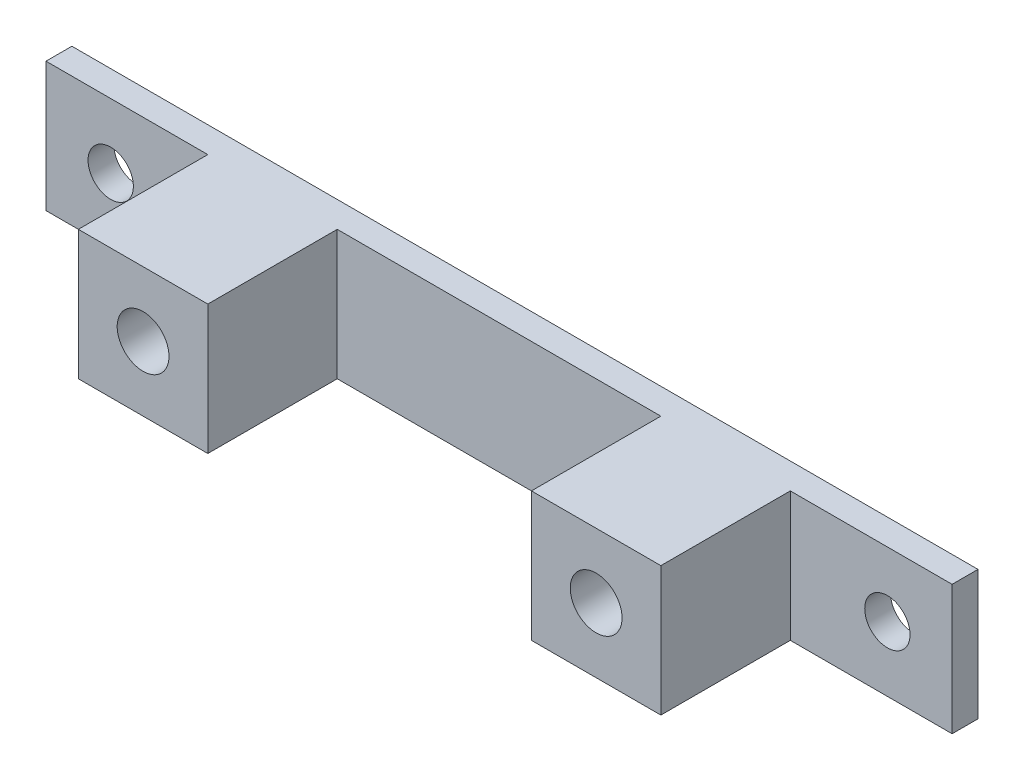
ISO-10303-21;
HEADER;
FILE_DESCRIPTION(('STEP AP214'),'2;1');
FILE_NAME('part.step','',(''),(''),'','','');
FILE_SCHEMA(('AUTOMOTIVE_DESIGN { 1 0 10303 214 1 1 1 1 }'));
ENDSEC;
DATA;
#1=APPLICATION_CONTEXT('core data for automotive mechanical design processes');
#2=APPLICATION_PROTOCOL_DEFINITION('international standard','automotive_design',2000,#1);
#3=PRODUCT_CONTEXT('',#1,'mechanical');
#4=PRODUCT('Part','Part','',(#3));
#5=PRODUCT_RELATED_PRODUCT_CATEGORY('part','',(#4));
#6=PRODUCT_DEFINITION_FORMATION('','',#4);
#7=PRODUCT_DEFINITION_CONTEXT('part definition',#1,'design');
#8=PRODUCT_DEFINITION('design','',#6,#7);
#9=PRODUCT_DEFINITION_SHAPE('','',#8);
#10=(LENGTH_UNIT() NAMED_UNIT(*) SI_UNIT(.MILLI.,.METRE.));
#11=(NAMED_UNIT(*) PLANE_ANGLE_UNIT() SI_UNIT($,.RADIAN.));
#12=(NAMED_UNIT(*) SI_UNIT($,.STERADIAN.) SOLID_ANGLE_UNIT());
#13=UNCERTAINTY_MEASURE_WITH_UNIT(LENGTH_MEASURE(1.E-05),#10,'distance_accuracy_value','');
#14=(GEOMETRIC_REPRESENTATION_CONTEXT(3) GLOBAL_UNCERTAINTY_ASSIGNED_CONTEXT((#13)) GLOBAL_UNIT_ASSIGNED_CONTEXT((#10,
#11,#12)) REPRESENTATION_CONTEXT('',''));
#15=CARTESIAN_POINT('',(0.,0.,0.));
#16=DIRECTION('',(0.,0.,1.));
#17=DIRECTION('',(1.,0.,0.));
#18=AXIS2_PLACEMENT_3D('',#15,#16,#17);
#19=CARTESIAN_POINT('',(0.,0.,2.));
#20=DIRECTION('',(0.,0.,-1.));
#21=DIRECTION('',(-1.,0.,0.));
#22=AXIS2_PLACEMENT_3D('',#19,#20,#21);
#23=PLANE('',#22);
#24=CARTESIAN_POINT('',(65.,5.,2.));
#25=DIRECTION('',(0.,0.,-1.));
#26=DIRECTION('',(-1.,0.,0.));
#27=AXIS2_PLACEMENT_3D('',#24,#25,#26);
#28=CIRCLE('',#27,1.75);
#29=CARTESIAN_POINT('',(63.25,5.,2.));
#30=VERTEX_POINT('',#29);
#31=EDGE_CURVE('E230',#30,#30,#28,.T.);
#32=ORIENTED_EDGE('',*,*,#31,.T.);
#33=EDGE_LOOP('',(#32));
#34=FACE_BOUND('',#33,.T.);
#35=DIRECTION('',(0.,1.,0.));
#36=VECTOR('',#35,1.);
#37=CARTESIAN_POINT('',(57.5,10.,2.));
#38=LINE('',#37,#36);
#39=CARTESIAN_POINT('',(57.5,0.,2.));
#40=VERTEX_POINT('',#39);
#41=CARTESIAN_POINT('',(57.5,10.,2.));
#42=VERTEX_POINT('',#41);
#43=EDGE_CURVE('E54',#40,#42,#38,.T.);
#44=ORIENTED_EDGE('',*,*,#43,.F.);
#45=DIRECTION('',(1.,0.,0.));
#46=VECTOR('',#45,1.);
#47=CARTESIAN_POINT('',(0.,0.,2.));
#48=LINE('',#47,#46);
#49=CARTESIAN_POINT('',(70.,0.,2.));
#50=VERTEX_POINT('',#49);
#51=EDGE_CURVE('E188',#40,#50,#48,.T.);
#52=ORIENTED_EDGE('',*,*,#51,.T.);
#53=DIRECTION('',(0.,1.,0.));
#54=VECTOR('',#53,1.);
#55=CARTESIAN_POINT('',(70.,0.,2.));
#56=LINE('',#55,#54);
#57=CARTESIAN_POINT('',(70.,10.,2.));
#58=VERTEX_POINT('',#57);
#59=EDGE_CURVE('E192',#50,#58,#56,.T.);
#60=ORIENTED_EDGE('',*,*,#59,.T.);
#61=DIRECTION('',(-1.,0.,0.));
#62=VECTOR('',#61,1.);
#63=CARTESIAN_POINT('',(0.,10.,2.));
#64=LINE('',#63,#62);
#65=EDGE_CURVE('E195',#58,#42,#64,.T.);
#66=ORIENTED_EDGE('',*,*,#65,.T.);
#67=EDGE_LOOP('',(#44,#52,#60,#66));
#68=FACE_BOUND('',#67,.T.);
#69=ADVANCED_FACE('F37',(#34,#68),#23,.F.);
#70=DIRECTION('',(0.,-1.,0.));
#71=VECTOR('',#70,1.);
#72=CARTESIAN_POINT('',(47.5,10.,2.));
#73=LINE('',#72,#71);
#74=CARTESIAN_POINT('',(47.5,10.,2.));
#75=VERTEX_POINT('',#74);
#76=CARTESIAN_POINT('',(47.5,0.,2.));
#77=VERTEX_POINT('',#76);
#78=EDGE_CURVE('E149',#75,#77,#73,.T.);
#79=ORIENTED_EDGE('',*,*,#78,.F.);
#80=CARTESIAN_POINT('',(22.5,10.,2.));
#81=VERTEX_POINT('',#80);
#82=EDGE_CURVE('E198',#75,#81,#64,.T.);
#83=ORIENTED_EDGE('',*,*,#82,.T.);
#84=DIRECTION('',(0.,1.,0.));
#85=VECTOR('',#84,1.);
#86=CARTESIAN_POINT('',(22.5,10.,2.));
#87=LINE('',#86,#85);
#88=CARTESIAN_POINT('',(22.5,0.,2.));
#89=VERTEX_POINT('',#88);
#90=EDGE_CURVE('E155',#89,#81,#87,.T.);
#91=ORIENTED_EDGE('',*,*,#90,.F.);
#92=EDGE_CURVE('E62',#89,#77,#48,.T.);
#93=ORIENTED_EDGE('',*,*,#92,.T.);
#94=EDGE_LOOP('',(#79,#83,#91,#93));
#95=FACE_BOUND('',#94,.T.);
#96=ADVANCED_FACE('F245',(#95),#23,.F.);
#97=CARTESIAN_POINT('',(5.,5.,2.));
#98=DIRECTION('',(0.,0.,-1.));
#99=DIRECTION('',(-1.,0.,0.));
#100=AXIS2_PLACEMENT_3D('',#97,#98,#99);
#101=CIRCLE('',#100,1.75);
#102=CARTESIAN_POINT('',(3.25,5.,2.));
#103=VERTEX_POINT('',#102);
#104=EDGE_CURVE('E214',#103,#103,#101,.T.);
#105=ORIENTED_EDGE('',*,*,#104,.T.);
#106=EDGE_LOOP('',(#105));
#107=FACE_BOUND('',#106,.T.);
#108=DIRECTION('',(0.,-1.,0.));
#109=VECTOR('',#108,1.);
#110=CARTESIAN_POINT('',(12.5,10.,2.));
#111=LINE('',#110,#109);
#112=CARTESIAN_POINT('',(12.5,10.,2.));
#113=VERTEX_POINT('',#112);
#114=CARTESIAN_POINT('',(12.5,0.,2.));
#115=VERTEX_POINT('',#114);
#116=EDGE_CURVE('E152',#113,#115,#111,.T.);
#117=ORIENTED_EDGE('',*,*,#116,.F.);
#118=CARTESIAN_POINT('',(0.,10.,2.));
#119=VERTEX_POINT('',#118);
#120=EDGE_CURVE('E194',#113,#119,#64,.T.);
#121=ORIENTED_EDGE('',*,*,#120,.T.);
#122=DIRECTION('',(0.,-1.,0.));
#123=VECTOR('',#122,1.);
#124=CARTESIAN_POINT('',(0.,0.,2.));
#125=LINE('',#124,#123);
#126=CARTESIAN_POINT('',(0.,0.,2.));
#127=VERTEX_POINT('',#126);
#128=EDGE_CURVE('E185',#119,#127,#125,.T.);
#129=ORIENTED_EDGE('',*,*,#128,.T.);
#130=EDGE_CURVE('E190',#127,#115,#48,.T.);
#131=ORIENTED_EDGE('',*,*,#130,.T.);
#132=EDGE_LOOP('',(#117,#121,#129,#131));
#133=FACE_BOUND('',#132,.T.);
#134=ADVANCED_FACE('F260',(#107,#133),#23,.F.);
#135=CARTESIAN_POINT('',(0.,0.,2.));
#136=DIRECTION('',(1.,0.,0.));
#137=DIRECTION('',(0.,0.,-1.));
#138=AXIS2_PLACEMENT_3D('',#135,#136,#137);
#139=PLANE('',#138);
#140=DIRECTION('',(0.,-1.,0.));
#141=VECTOR('',#140,1.);
#142=CARTESIAN_POINT('',(0.,0.,0.));
#143=LINE('',#142,#141);
#144=CARTESIAN_POINT('',(0.,10.,0.));
#145=VERTEX_POINT('',#144);
#146=CARTESIAN_POINT('',(0.,0.,0.));
#147=VERTEX_POINT('',#146);
#148=EDGE_CURVE('E184',#145,#147,#143,.T.);
#149=ORIENTED_EDGE('',*,*,#148,.T.);
#150=DIRECTION('',(0.,0.,-1.));
#151=VECTOR('',#150,1.);
#152=CARTESIAN_POINT('',(0.,0.,2.));
#153=LINE('',#152,#151);
#154=EDGE_CURVE('E11',#127,#147,#153,.T.);
#155=ORIENTED_EDGE('',*,*,#154,.F.);
#156=ORIENTED_EDGE('',*,*,#128,.F.);
#157=DIRECTION('',(0.,0.,-1.));
#158=VECTOR('',#157,1.);
#159=CARTESIAN_POINT('',(0.,10.,2.));
#160=LINE('',#159,#158);
#161=EDGE_CURVE('E197',#119,#145,#160,.T.);
#162=ORIENTED_EDGE('',*,*,#161,.T.);
#163=EDGE_LOOP('',(#149,#155,#156,#162));
#164=FACE_BOUND('',#163,.T.);
#165=ADVANCED_FACE('F39',(#164),#139,.F.);
#166=CARTESIAN_POINT('',(0.,0.,2.));
#167=DIRECTION('',(0.,1.,0.));
#168=DIRECTION('',(0.,0.,1.));
#169=AXIS2_PLACEMENT_3D('',#166,#167,#168);
#170=PLANE('',#169);
#171=DIRECTION('',(1.,0.,0.));
#172=VECTOR('',#171,1.);
#173=CARTESIAN_POINT('',(0.,0.,0.));
#174=LINE('',#173,#172);
#175=CARTESIAN_POINT('',(70.,0.,0.));
#176=VERTEX_POINT('',#175);
#177=EDGE_CURVE('E201',#147,#176,#174,.T.);
#178=ORIENTED_EDGE('',*,*,#177,.T.);
#179=DIRECTION('',(0.,0.,-1.));
#180=VECTOR('',#179,1.);
#181=CARTESIAN_POINT('',(70.,0.,2.));
#182=LINE('',#181,#180);
#183=EDGE_CURVE('E46',#50,#176,#182,.T.);
#184=ORIENTED_EDGE('',*,*,#183,.F.);
#185=ORIENTED_EDGE('',*,*,#51,.F.);
#186=DIRECTION('',(0.,0.,-1.));
#187=VECTOR('',#186,1.);
#188=CARTESIAN_POINT('',(57.5,0.,12.));
#189=LINE('',#188,#187);
#190=CARTESIAN_POINT('',(57.5,0.,12.));
#191=VERTEX_POINT('',#190);
#192=EDGE_CURVE('E235',#191,#40,#189,.T.);
#193=ORIENTED_EDGE('',*,*,#192,.F.);
#194=DIRECTION('',(1.,0.,0.));
#195=VECTOR('',#194,1.);
#196=CARTESIAN_POINT('',(57.5,0.,12.));
#197=LINE('',#196,#195);
#198=CARTESIAN_POINT('',(47.5,0.,12.));
#199=VERTEX_POINT('',#198);
#200=EDGE_CURVE('E145',#199,#191,#197,.T.);
#201=ORIENTED_EDGE('',*,*,#200,.F.);
#202=DIRECTION('',(0.,0.,-1.));
#203=VECTOR('',#202,1.);
#204=CARTESIAN_POINT('',(47.5,0.,12.));
#205=LINE('',#204,#203);
#206=EDGE_CURVE('E157',#199,#77,#205,.T.);
#207=ORIENTED_EDGE('',*,*,#206,.T.);
#208=ORIENTED_EDGE('',*,*,#92,.F.);
#209=DIRECTION('',(0.,0.,-1.));
#210=VECTOR('',#209,1.);
#211=CARTESIAN_POINT('',(22.5,0.,12.));
#212=LINE('',#211,#210);
#213=CARTESIAN_POINT('',(22.5,0.,12.));
#214=VERTEX_POINT('',#213);
#215=EDGE_CURVE('E178',#214,#89,#212,.T.);
#216=ORIENTED_EDGE('',*,*,#215,.F.);
#217=DIRECTION('',(1.,0.,0.));
#218=VECTOR('',#217,1.);
#219=CARTESIAN_POINT('',(12.5,0.,12.));
#220=LINE('',#219,#218);
#221=CARTESIAN_POINT('',(12.5,0.,12.));
#222=VERTEX_POINT('',#221);
#223=EDGE_CURVE('E164',#222,#214,#220,.T.);
#224=ORIENTED_EDGE('',*,*,#223,.F.);
#225=DIRECTION('',(0.,0.,-1.));
#226=VECTOR('',#225,1.);
#227=CARTESIAN_POINT('',(12.5,0.,12.));
#228=LINE('',#227,#226);
#229=EDGE_CURVE('E181',#222,#115,#228,.T.);
#230=ORIENTED_EDGE('',*,*,#229,.T.);
#231=ORIENTED_EDGE('',*,*,#130,.F.);
#232=ORIENTED_EDGE('',*,*,#154,.T.);
#233=EDGE_LOOP('',(#178,#184,#185,#193,#201,#207,#208,#216,#224,#230,#231,#232));
#234=FACE_BOUND('',#233,.T.);
#235=ADVANCED_FACE('F241',(#234),#170,.F.);
#236=CARTESIAN_POINT('',(70.,0.,2.));
#237=DIRECTION('',(-1.,0.,0.));
#238=DIRECTION('',(0.,0.,1.));
#239=AXIS2_PLACEMENT_3D('',#236,#237,#238);
#240=PLANE('',#239);
#241=DIRECTION('',(0.,1.,0.));
#242=VECTOR('',#241,1.);
#243=CARTESIAN_POINT('',(70.,0.,0.));
#244=LINE('',#243,#242);
#245=CARTESIAN_POINT('',(70.,10.,0.));
#246=VERTEX_POINT('',#245);
#247=EDGE_CURVE('E203',#176,#246,#244,.T.);
#248=ORIENTED_EDGE('',*,*,#247,.T.);
#249=DIRECTION('',(0.,0.,-1.));
#250=VECTOR('',#249,1.);
#251=CARTESIAN_POINT('',(70.,10.,2.));
#252=LINE('',#251,#250);
#253=EDGE_CURVE('E208',#58,#246,#252,.T.);
#254=ORIENTED_EDGE('',*,*,#253,.F.);
#255=ORIENTED_EDGE('',*,*,#59,.F.);
#256=ORIENTED_EDGE('',*,*,#183,.T.);
#257=EDGE_LOOP('',(#248,#254,#255,#256));
#258=FACE_BOUND('',#257,.T.);
#259=ADVANCED_FACE('F272',(#258),#240,.F.);
#260=CARTESIAN_POINT('',(0.,10.,2.));
#261=DIRECTION('',(0.,-1.,0.));
#262=DIRECTION('',(0.,0.,-1.));
#263=AXIS2_PLACEMENT_3D('',#260,#261,#262);
#264=PLANE('',#263);
#265=DIRECTION('',(-1.,0.,0.));
#266=VECTOR('',#265,1.);
#267=CARTESIAN_POINT('',(0.,10.,0.));
#268=LINE('',#267,#266);
#269=EDGE_CURVE('E189',#246,#145,#268,.T.);
#270=ORIENTED_EDGE('',*,*,#269,.T.);
#271=ORIENTED_EDGE('',*,*,#161,.F.);
#272=ORIENTED_EDGE('',*,*,#120,.F.);
#273=DIRECTION('',(0.,0.,-1.));
#274=VECTOR('',#273,1.);
#275=CARTESIAN_POINT('',(12.5,10.,12.));
#276=LINE('',#275,#274);
#277=CARTESIAN_POINT('',(12.5,10.,12.));
#278=VERTEX_POINT('',#277);
#279=EDGE_CURVE('E169',#278,#113,#276,.T.);
#280=ORIENTED_EDGE('',*,*,#279,.F.);
#281=DIRECTION('',(-1.,0.,0.));
#282=VECTOR('',#281,1.);
#283=CARTESIAN_POINT('',(12.5,10.,12.));
#284=LINE('',#283,#282);
#285=CARTESIAN_POINT('',(22.5,10.,12.));
#286=VERTEX_POINT('',#285);
#287=EDGE_CURVE('E168',#286,#278,#284,.T.);
#288=ORIENTED_EDGE('',*,*,#287,.F.);
#289=DIRECTION('',(0.,0.,-1.));
#290=VECTOR('',#289,1.);
#291=CARTESIAN_POINT('',(22.5,10.,12.));
#292=LINE('',#291,#290);
#293=EDGE_CURVE('E175',#286,#81,#292,.T.);
#294=ORIENTED_EDGE('',*,*,#293,.T.);
#295=ORIENTED_EDGE('',*,*,#82,.F.);
#296=DIRECTION('',(0.,0.,-1.));
#297=VECTOR('',#296,1.);
#298=CARTESIAN_POINT('',(47.5,10.,12.));
#299=LINE('',#298,#297);
#300=CARTESIAN_POINT('',(47.5,10.,12.));
#301=VERTEX_POINT('',#300);
#302=EDGE_CURVE('E136',#301,#75,#299,.T.);
#303=ORIENTED_EDGE('',*,*,#302,.F.);
#304=DIRECTION('',(-1.,0.,0.));
#305=VECTOR('',#304,1.);
#306=CARTESIAN_POINT('',(57.5,10.,12.));
#307=LINE('',#306,#305);
#308=CARTESIAN_POINT('',(57.5,10.,12.));
#309=VERTEX_POINT('',#308);
#310=EDGE_CURVE('E129',#309,#301,#307,.T.);
#311=ORIENTED_EDGE('',*,*,#310,.F.);
#312=DIRECTION('',(0.,0.,-1.));
#313=VECTOR('',#312,1.);
#314=CARTESIAN_POINT('',(57.5,10.,12.));
#315=LINE('',#314,#313);
#316=EDGE_CURVE('E134',#309,#42,#315,.T.);
#317=ORIENTED_EDGE('',*,*,#316,.T.);
#318=ORIENTED_EDGE('',*,*,#65,.F.);
#319=ORIENTED_EDGE('',*,*,#253,.T.);
#320=EDGE_LOOP('',(#270,#271,#272,#280,#288,#294,#295,#303,#311,#317,#318,#319));
#321=FACE_BOUND('',#320,.T.);
#322=ADVANCED_FACE('F131',(#321),#264,.F.);
#323=CARTESIAN_POINT('',(0.,0.,0.));
#324=DIRECTION('',(0.,0.,-1.));
#325=DIRECTION('',(-1.,0.,0.));
#326=AXIS2_PLACEMENT_3D('',#323,#324,#325);
#327=PLANE('',#326);
#328=CARTESIAN_POINT('',(65.,5.,0.));
#329=DIRECTION('',(0.,0.,-1.));
#330=DIRECTION('',(-1.,0.,0.));
#331=AXIS2_PLACEMENT_3D('',#328,#329,#330);
#332=CIRCLE('',#331,1.75);
#333=CARTESIAN_POINT('',(63.25,5.,0.));
#334=VERTEX_POINT('',#333);
#335=EDGE_CURVE('E41',#334,#334,#332,.T.);
#336=ORIENTED_EDGE('',*,*,#335,.F.);
#337=EDGE_LOOP('',(#336));
#338=FACE_BOUND('',#337,.T.);
#339=CARTESIAN_POINT('',(5.,5.,0.));
#340=DIRECTION('',(0.,0.,-1.));
#341=DIRECTION('',(-1.,0.,0.));
#342=AXIS2_PLACEMENT_3D('',#339,#340,#341);
#343=CIRCLE('',#342,1.75);
#344=CARTESIAN_POINT('',(3.25,5.,0.));
#345=VERTEX_POINT('',#344);
#346=EDGE_CURVE('E212',#345,#345,#343,.T.);
#347=ORIENTED_EDGE('',*,*,#346,.F.);
#348=EDGE_LOOP('',(#347));
#349=FACE_BOUND('',#348,.T.);
#350=CARTESIAN_POINT('',(17.5,5.,0.));
#351=DIRECTION('',(0.,0.,-1.));
#352=DIRECTION('',(-1.,0.,0.));
#353=AXIS2_PLACEMENT_3D('',#350,#351,#352);
#354=CIRCLE('',#353,2.);
#355=CARTESIAN_POINT('',(15.5,5.,0.));
#356=VERTEX_POINT('',#355);
#357=EDGE_CURVE('E215',#356,#356,#354,.T.);
#358=ORIENTED_EDGE('',*,*,#357,.F.);
#359=EDGE_LOOP('',(#358));
#360=FACE_BOUND('',#359,.T.);
#361=CARTESIAN_POINT('',(52.5,5.,0.));
#362=DIRECTION('',(0.,0.,-1.));
#363=DIRECTION('',(-1.,0.,0.));
#364=AXIS2_PLACEMENT_3D('',#361,#362,#363);
#365=CIRCLE('',#364,2.);
#366=CARTESIAN_POINT('',(50.5,5.,0.));
#367=VERTEX_POINT('',#366);
#368=EDGE_CURVE('E221',#367,#367,#365,.T.);
#369=ORIENTED_EDGE('',*,*,#368,.F.);
#370=EDGE_LOOP('',(#369));
#371=FACE_BOUND('',#370,.T.);
#372=ORIENTED_EDGE('',*,*,#148,.F.);
#373=ORIENTED_EDGE('',*,*,#269,.F.);
#374=ORIENTED_EDGE('',*,*,#247,.F.);
#375=ORIENTED_EDGE('',*,*,#177,.F.);
#376=EDGE_LOOP('',(#372,#373,#374,#375));
#377=FACE_BOUND('',#376,.T.);
#378=ADVANCED_FACE('F274',(#338,#349,#360,#371,#377),#327,.T.);
#379=CARTESIAN_POINT('',(12.5,10.,12.));
#380=DIRECTION('',(1.,0.,0.));
#381=DIRECTION('',(0.,0.,-1.));
#382=AXIS2_PLACEMENT_3D('',#379,#380,#381);
#383=PLANE('',#382);
#384=ORIENTED_EDGE('',*,*,#116,.T.);
#385=ORIENTED_EDGE('',*,*,#229,.F.);
#386=DIRECTION('',(0.,-1.,0.));
#387=VECTOR('',#386,1.);
#388=CARTESIAN_POINT('',(12.5,10.,12.));
#389=LINE('',#388,#387);
#390=EDGE_CURVE('E161',#278,#222,#389,.T.);
#391=ORIENTED_EDGE('',*,*,#390,.F.);
#392=ORIENTED_EDGE('',*,*,#279,.T.);
#393=EDGE_LOOP('',(#384,#385,#391,#392));
#394=FACE_BOUND('',#393,.T.);
#395=ADVANCED_FACE('F258',(#394),#383,.F.);
#396=CARTESIAN_POINT('',(22.5,10.,12.));
#397=DIRECTION('',(-1.,0.,0.));
#398=DIRECTION('',(0.,0.,1.));
#399=AXIS2_PLACEMENT_3D('',#396,#397,#398);
#400=PLANE('',#399);
#401=ORIENTED_EDGE('',*,*,#90,.T.);
#402=ORIENTED_EDGE('',*,*,#293,.F.);
#403=DIRECTION('',(0.,1.,0.));
#404=VECTOR('',#403,1.);
#405=CARTESIAN_POINT('',(22.5,10.,12.));
#406=LINE('',#405,#404);
#407=EDGE_CURVE('E166',#214,#286,#406,.T.);
#408=ORIENTED_EDGE('',*,*,#407,.F.);
#409=ORIENTED_EDGE('',*,*,#215,.T.);
#410=EDGE_LOOP('',(#401,#402,#408,#409));
#411=FACE_BOUND('',#410,.T.);
#412=ADVANCED_FACE('F248',(#411),#400,.F.);
#413=CARTESIAN_POINT('',(0.,0.,12.));
#414=DIRECTION('',(0.,0.,1.));
#415=DIRECTION('',(1.,0.,0.));
#416=AXIS2_PLACEMENT_3D('',#413,#414,#415);
#417=PLANE('',#416);
#418=CARTESIAN_POINT('',(17.5,5.,12.));
#419=DIRECTION('',(0.,0.,1.));
#420=DIRECTION('',(1.,0.,0.));
#421=AXIS2_PLACEMENT_3D('',#418,#419,#420);
#422=CIRCLE('',#421,2.);
#423=CARTESIAN_POINT('',(19.5,5.,12.));
#424=VERTEX_POINT('',#423);
#425=EDGE_CURVE('E444',#424,#424,#422,.T.);
#426=ORIENTED_EDGE('',*,*,#425,.F.);
#427=EDGE_LOOP('',(#426));
#428=FACE_BOUND('',#427,.T.);
#429=ORIENTED_EDGE('',*,*,#390,.T.);
#430=ORIENTED_EDGE('',*,*,#223,.T.);
#431=ORIENTED_EDGE('',*,*,#407,.T.);
#432=ORIENTED_EDGE('',*,*,#287,.T.);
#433=EDGE_LOOP('',(#429,#430,#431,#432));
#434=FACE_BOUND('',#433,.T.);
#435=ADVANCED_FACE('F255',(#428,#434),#417,.T.);
#436=CARTESIAN_POINT('',(57.5,10.,12.));
#437=DIRECTION('',(-1.,0.,0.));
#438=DIRECTION('',(0.,0.,1.));
#439=AXIS2_PLACEMENT_3D('',#436,#437,#438);
#440=PLANE('',#439);
#441=ORIENTED_EDGE('',*,*,#43,.T.);
#442=ORIENTED_EDGE('',*,*,#316,.F.);
#443=DIRECTION('',(0.,1.,0.));
#444=VECTOR('',#443,1.);
#445=CARTESIAN_POINT('',(57.5,10.,12.));
#446=LINE('',#445,#444);
#447=EDGE_CURVE('E140',#191,#309,#446,.T.);
#448=ORIENTED_EDGE('',*,*,#447,.F.);
#449=ORIENTED_EDGE('',*,*,#192,.T.);
#450=EDGE_LOOP('',(#441,#442,#448,#449));
#451=FACE_BOUND('',#450,.T.);
#452=ADVANCED_FACE('F151',(#451),#440,.F.);
#453=CARTESIAN_POINT('',(47.5,10.,12.));
#454=DIRECTION('',(1.,0.,0.));
#455=DIRECTION('',(0.,1.,0.));
#456=AXIS2_PLACEMENT_3D('',#453,#454,#455);
#457=PLANE('',#456);
#458=ORIENTED_EDGE('',*,*,#78,.T.);
#459=ORIENTED_EDGE('',*,*,#206,.F.);
#460=DIRECTION('',(0.,-1.,0.));
#461=VECTOR('',#460,1.);
#462=CARTESIAN_POINT('',(47.5,10.,12.));
#463=LINE('',#462,#461);
#464=EDGE_CURVE('E139',#301,#199,#463,.T.);
#465=ORIENTED_EDGE('',*,*,#464,.F.);
#466=ORIENTED_EDGE('',*,*,#302,.T.);
#467=EDGE_LOOP('',(#458,#459,#465,#466));
#468=FACE_BOUND('',#467,.T.);
#469=ADVANCED_FACE('F244',(#468),#457,.F.);
#470=CARTESIAN_POINT('',(0.,0.,12.));
#471=DIRECTION('',(0.,0.,-1.));
#472=DIRECTION('',(-1.,0.,0.));
#473=AXIS2_PLACEMENT_3D('',#470,#471,#472);
#474=PLANE('',#473);
#475=CARTESIAN_POINT('',(52.5,5.,12.));
#476=DIRECTION('',(0.,0.,1.));
#477=DIRECTION('',(1.,0.,0.));
#478=AXIS2_PLACEMENT_3D('',#475,#476,#477);
#479=CIRCLE('',#478,2.);
#480=CARTESIAN_POINT('',(54.5,5.,12.));
#481=VERTEX_POINT('',#480);
#482=EDGE_CURVE('E226',#481,#481,#479,.T.);
#483=ORIENTED_EDGE('',*,*,#482,.F.);
#484=EDGE_LOOP('',(#483));
#485=FACE_BOUND('',#484,.T.);
#486=ORIENTED_EDGE('',*,*,#447,.T.);
#487=ORIENTED_EDGE('',*,*,#310,.T.);
#488=ORIENTED_EDGE('',*,*,#464,.T.);
#489=ORIENTED_EDGE('',*,*,#200,.T.);
#490=EDGE_LOOP('',(#486,#487,#488,#489));
#491=FACE_BOUND('',#490,.T.);
#492=ADVANCED_FACE('F143',(#485,#491),#474,.F.);
#493=CARTESIAN_POINT('',(52.5,5.,-8.));
#494=DIRECTION('',(0.,0.,1.));
#495=DIRECTION('',(1.,0.,0.));
#496=AXIS2_PLACEMENT_3D('',#493,#494,#495);
#497=CYLINDRICAL_SURFACE('',#496,2.);
#498=ORIENTED_EDGE('',*,*,#368,.T.);
#499=EDGE_LOOP('',(#498));
#500=FACE_BOUND('',#499,.T.);
#501=ORIENTED_EDGE('',*,*,#482,.T.);
#502=EDGE_LOOP('',(#501));
#503=FACE_BOUND('',#502,.T.);
#504=ADVANCED_FACE('F310',(#500,#503),#497,.F.);
#505=CARTESIAN_POINT('',(17.5,5.,-8.));
#506=DIRECTION('',(0.,0.,1.));
#507=DIRECTION('',(1.,0.,0.));
#508=AXIS2_PLACEMENT_3D('',#505,#506,#507);
#509=CYLINDRICAL_SURFACE('',#508,2.);
#510=ORIENTED_EDGE('',*,*,#357,.T.);
#511=EDGE_LOOP('',(#510));
#512=FACE_BOUND('',#511,.T.);
#513=ORIENTED_EDGE('',*,*,#425,.T.);
#514=EDGE_LOOP('',(#513));
#515=FACE_BOUND('',#514,.T.);
#516=ADVANCED_FACE('F302',(#512,#515),#509,.F.);
#517=CARTESIAN_POINT('',(5.,5.,-8.));
#518=DIRECTION('',(0.,0.,1.));
#519=DIRECTION('',(1.,0.,0.));
#520=AXIS2_PLACEMENT_3D('',#517,#518,#519);
#521=CYLINDRICAL_SURFACE('',#520,1.75);
#522=ORIENTED_EDGE('',*,*,#346,.T.);
#523=EDGE_LOOP('',(#522));
#524=FACE_BOUND('',#523,.T.);
#525=ORIENTED_EDGE('',*,*,#104,.F.);
#526=EDGE_LOOP('',(#525));
#527=FACE_BOUND('',#526,.T.);
#528=ADVANCED_FACE('F299',(#524,#527),#521,.F.);
#529=CARTESIAN_POINT('',(65.,5.,-8.));
#530=DIRECTION('',(0.,0.,1.));
#531=DIRECTION('',(1.,0.,0.));
#532=AXIS2_PLACEMENT_3D('',#529,#530,#531);
#533=CYLINDRICAL_SURFACE('',#532,1.75);
#534=ORIENTED_EDGE('',*,*,#335,.T.);
#535=EDGE_LOOP('',(#534));
#536=FACE_BOUND('',#535,.T.);
#537=ORIENTED_EDGE('',*,*,#31,.F.);
#538=EDGE_LOOP('',(#537));
#539=FACE_BOUND('',#538,.T.);
#540=ADVANCED_FACE('F301',(#536,#539),#533,.F.);
#541=CLOSED_SHELL('',(#69,#96,#134,#165,#235,#259,#322,#378,#395,#412,#435,#452,#469,#492,#504,
#516,#528,#540));
#542=MANIFOLD_SOLID_BREP('B2',#541);
#543=ADVANCED_BREP_SHAPE_REPRESENTATION('',(#18,#542),#14);
#544=SHAPE_DEFINITION_REPRESENTATION(#9,#543);
ENDSEC;
END-ISO-10303-21;
